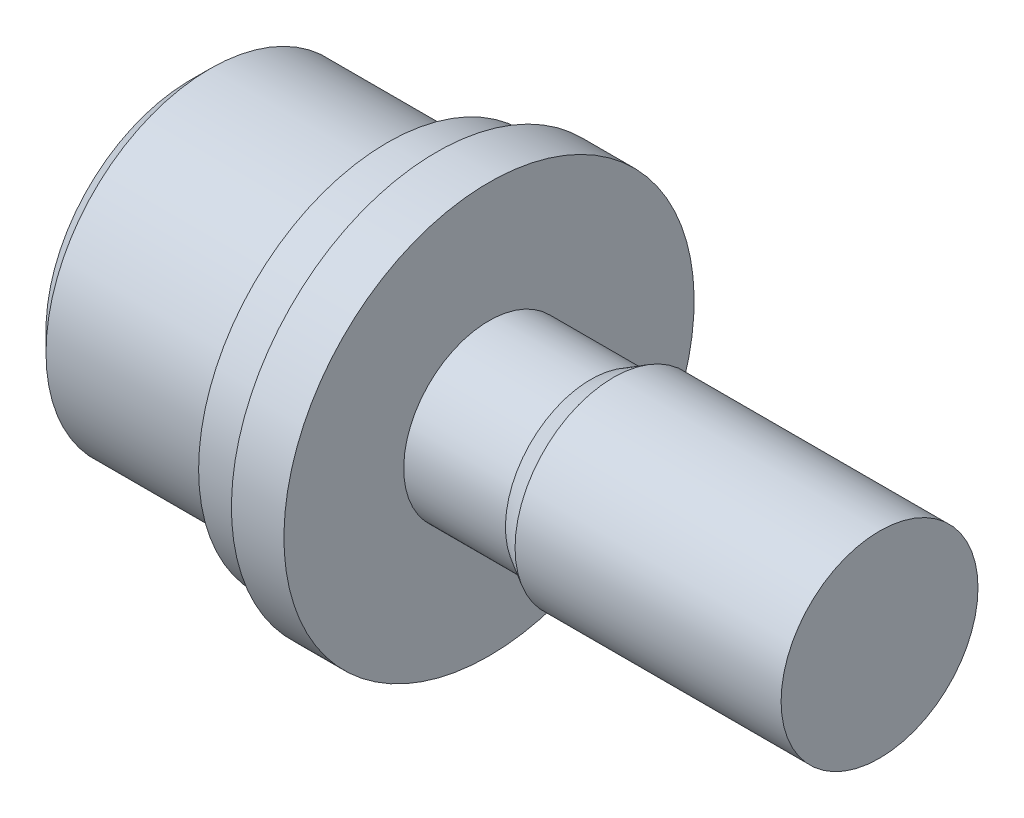
ISO-10303-21;
HEADER;
FILE_DESCRIPTION(('STEP AP214'),'2;1');
FILE_NAME('part.step','',(''),(''),'','','');
FILE_SCHEMA(('AUTOMOTIVE_DESIGN { 1 0 10303 214 1 1 1 1 }'));
ENDSEC;
DATA;
#1=APPLICATION_CONTEXT('core data for automotive mechanical design processes');
#2=APPLICATION_PROTOCOL_DEFINITION('international standard','automotive_design',2000,#1);
#3=PRODUCT_CONTEXT('',#1,'mechanical');
#4=PRODUCT('Part','Part','',(#3));
#5=PRODUCT_RELATED_PRODUCT_CATEGORY('part','',(#4));
#6=PRODUCT_DEFINITION_FORMATION('','',#4);
#7=PRODUCT_DEFINITION_CONTEXT('part definition',#1,'design');
#8=PRODUCT_DEFINITION('design','',#6,#7);
#9=PRODUCT_DEFINITION_SHAPE('','',#8);
#10=(LENGTH_UNIT() NAMED_UNIT(*) SI_UNIT(.MILLI.,.METRE.));
#11=(NAMED_UNIT(*) PLANE_ANGLE_UNIT() SI_UNIT($,.RADIAN.));
#12=(NAMED_UNIT(*) SI_UNIT($,.STERADIAN.) SOLID_ANGLE_UNIT());
#13=UNCERTAINTY_MEASURE_WITH_UNIT(LENGTH_MEASURE(1.E-05),#10,'distance_accuracy_value','');
#14=(GEOMETRIC_REPRESENTATION_CONTEXT(3) GLOBAL_UNCERTAINTY_ASSIGNED_CONTEXT((#13)) GLOBAL_UNIT_ASSIGNED_CONTEXT((#10,
#11,#12)) REPRESENTATION_CONTEXT('',''));
#15=CARTESIAN_POINT('',(0.,0.,0.));
#16=DIRECTION('',(0.,0.,1.));
#17=DIRECTION('',(1.,0.,0.));
#18=AXIS2_PLACEMENT_3D('',#15,#16,#17);
#19=CARTESIAN_POINT('',(-3.9,0.,0.));
#20=DIRECTION('',(-1.,0.,0.));
#21=DIRECTION('',(0.,0.,1.));
#22=AXIS2_PLACEMENT_3D('',#19,#20,#21);
#23=PLANE('',#22);
#24=DIRECTION('',(0.,-0.5,-0.866025403784438));
#25=VECTOR('',#24,1.);
#26=CARTESIAN_POINT('',(-3.9,2.1650635094611,-1.25));
#27=LINE('',#26,#25);
#28=CARTESIAN_POINT('',(-3.89999999999995,2.16506350946107,-1.24999999999999));
#29=VERTEX_POINT('',#28);
#30=CARTESIAN_POINT('',(-3.9,1.44337567297406,-2.5));
#31=VERTEX_POINT('',#30);
#32=EDGE_CURVE('E92',#29,#31,#27,.T.);
#33=ORIENTED_EDGE('',*,*,#32,.T.);
#34=DIRECTION('',(0.,1.,0.));
#35=VECTOR('',#34,1.);
#36=CARTESIAN_POINT('',(-3.9,0.,-2.5));
#37=LINE('',#36,#35);
#38=CARTESIAN_POINT('',(-3.89999999999995,0.,-2.49999999999997));
#39=VERTEX_POINT('',#38);
#40=EDGE_CURVE('E89',#31,#39,#37,.F.);
#41=ORIENTED_EDGE('',*,*,#40,.T.);
#42=CARTESIAN_POINT('',(-3.8999999999999,0.,0.));
#43=DIRECTION('',(-1.,0.,0.));
#44=DIRECTION('',(0.,0.,1.));
#45=AXIS2_PLACEMENT_3D('',#42,#43,#44);
#46=CIRCLE('',#45,2.49999999999995);
#47=EDGE_CURVE('E20',#39,#29,#46,.F.);
#48=ORIENTED_EDGE('',*,*,#47,.T.);
#49=EDGE_LOOP('',(#33,#41,#48));
#50=FACE_BOUND('',#49,.T.);
#51=ADVANCED_FACE('F17',(#50),#23,.T.);
#52=CARTESIAN_POINT('',(-3.9,0.,0.));
#53=DIRECTION('',(-1.,0.,0.));
#54=DIRECTION('',(0.,0.,1.));
#55=AXIS2_PLACEMENT_3D('',#52,#53,#54);
#56=PLANE('',#55);
#57=DIRECTION('',(0.,0.5,-0.866025403784439));
#58=VECTOR('',#57,1.);
#59=CARTESIAN_POINT('',(-3.9,2.1650635094611,1.25));
#60=LINE('',#59,#58);
#61=CARTESIAN_POINT('',(-3.89999999999995,2.16506350946107,1.24999999999999));
#62=VERTEX_POINT('',#61);
#63=CARTESIAN_POINT('',(-3.9,2.88675134594813,0.));
#64=VERTEX_POINT('',#63);
#65=EDGE_CURVE('E97',#62,#64,#60,.T.);
#66=ORIENTED_EDGE('',*,*,#65,.T.);
#67=DIRECTION('',(0.,-0.5,-0.866025403784439));
#68=VECTOR('',#67,1.);
#69=CARTESIAN_POINT('',(-3.9,2.88675134594813,0.));
#70=LINE('',#69,#68);
#71=EDGE_CURVE('E139',#64,#29,#70,.T.);
#72=ORIENTED_EDGE('',*,*,#71,.T.);
#73=CARTESIAN_POINT('',(-3.8999999999999,0.,0.));
#74=DIRECTION('',(-1.,0.,0.));
#75=DIRECTION('',(0.,0.,1.));
#76=AXIS2_PLACEMENT_3D('',#73,#74,#75);
#77=CIRCLE('',#76,2.49999999999995);
#78=EDGE_CURVE('E108',#29,#62,#77,.F.);
#79=ORIENTED_EDGE('',*,*,#78,.T.);
#80=EDGE_LOOP('',(#66,#72,#79));
#81=FACE_BOUND('',#80,.T.);
#82=ADVANCED_FACE('F188',(#81),#56,.T.);
#83=CARTESIAN_POINT('',(-3.9,0.,0.));
#84=DIRECTION('',(-1.,0.,0.));
#85=DIRECTION('',(0.,0.,1.));
#86=AXIS2_PLACEMENT_3D('',#83,#84,#85);
#87=PLANE('',#86);
#88=DIRECTION('',(0.,1.,0.));
#89=VECTOR('',#88,1.);
#90=CARTESIAN_POINT('',(-3.9,0.,2.5));
#91=LINE('',#90,#89);
#92=CARTESIAN_POINT('',(-3.89999999999996,0.,2.50000000000002));
#93=VERTEX_POINT('',#92);
#94=CARTESIAN_POINT('',(-3.9,1.44337567297406,2.5));
#95=VERTEX_POINT('',#94);
#96=EDGE_CURVE('E137',#93,#95,#91,.T.);
#97=ORIENTED_EDGE('',*,*,#96,.T.);
#98=DIRECTION('',(0.,0.5,-0.866025403784438));
#99=VECTOR('',#98,1.);
#100=CARTESIAN_POINT('',(-3.9,1.44337567297406,2.5));
#101=LINE('',#100,#99);
#102=EDGE_CURVE('E135',#95,#62,#101,.T.);
#103=ORIENTED_EDGE('',*,*,#102,.T.);
#104=CARTESIAN_POINT('',(-3.8999999999999,0.,0.));
#105=DIRECTION('',(-1.,0.,0.));
#106=DIRECTION('',(0.,0.,1.));
#107=AXIS2_PLACEMENT_3D('',#104,#105,#106);
#108=CIRCLE('',#107,2.49999999999995);
#109=EDGE_CURVE('E185',#62,#93,#108,.F.);
#110=ORIENTED_EDGE('',*,*,#109,.T.);
#111=EDGE_LOOP('',(#97,#103,#110));
#112=FACE_BOUND('',#111,.T.);
#113=ADVANCED_FACE('F429',(#112),#87,.T.);
#114=CARTESIAN_POINT('',(-3.9,0.,0.));
#115=DIRECTION('',(-1.,0.,0.));
#116=DIRECTION('',(0.,0.,1.));
#117=AXIS2_PLACEMENT_3D('',#114,#115,#116);
#118=PLANE('',#117);
#119=DIRECTION('',(0.,0.500000000000001,0.866025403784438));
#120=VECTOR('',#119,1.);
#121=CARTESIAN_POINT('',(-3.9,-2.1650635094611,1.25));
#122=LINE('',#121,#120);
#123=CARTESIAN_POINT('',(-3.89999999999995,-2.16506350946108,1.24999999999999));
#124=VERTEX_POINT('',#123);
#125=CARTESIAN_POINT('',(-3.9,-1.44337567297406,2.5));
#126=VERTEX_POINT('',#125);
#127=EDGE_CURVE('E133',#124,#126,#122,.T.);
#128=ORIENTED_EDGE('',*,*,#127,.T.);
#129=DIRECTION('',(0.,1.,0.));
#130=VECTOR('',#129,1.);
#131=CARTESIAN_POINT('',(-3.9,0.,2.5));
#132=LINE('',#131,#130);
#133=EDGE_CURVE('E131',#126,#93,#132,.T.);
#134=ORIENTED_EDGE('',*,*,#133,.T.);
#135=CARTESIAN_POINT('',(-3.8999999999999,0.,0.));
#136=DIRECTION('',(-1.,0.,0.));
#137=DIRECTION('',(0.,0.,1.));
#138=AXIS2_PLACEMENT_3D('',#135,#136,#137);
#139=CIRCLE('',#138,2.49999999999995);
#140=EDGE_CURVE('E182',#93,#124,#139,.F.);
#141=ORIENTED_EDGE('',*,*,#140,.T.);
#142=EDGE_LOOP('',(#128,#134,#141));
#143=FACE_BOUND('',#142,.T.);
#144=ADVANCED_FACE('F419',(#143),#118,.T.);
#145=CARTESIAN_POINT('',(-3.9,0.,0.));
#146=DIRECTION('',(-1.,0.,0.));
#147=DIRECTION('',(0.,0.,1.));
#148=AXIS2_PLACEMENT_3D('',#145,#146,#147);
#149=PLANE('',#148);
#150=DIRECTION('',(0.,-0.5,0.866025403784439));
#151=VECTOR('',#150,1.);
#152=CARTESIAN_POINT('',(-3.9,-2.1650635094611,-1.25));
#153=LINE('',#152,#151);
#154=CARTESIAN_POINT('',(-3.89999999999995,-2.16506350946107,-1.24999999999999));
#155=VERTEX_POINT('',#154);
#156=CARTESIAN_POINT('',(-3.9,-2.88675134594813,0.));
#157=VERTEX_POINT('',#156);
#158=EDGE_CURVE('E129',#155,#157,#153,.T.);
#159=ORIENTED_EDGE('',*,*,#158,.T.);
#160=DIRECTION('',(0.,0.499999999999999,0.866025403784439));
#161=VECTOR('',#160,1.);
#162=CARTESIAN_POINT('',(-3.9,-2.88675134594813,0.));
#163=LINE('',#162,#161);
#164=EDGE_CURVE('E109',#157,#124,#163,.T.);
#165=ORIENTED_EDGE('',*,*,#164,.T.);
#166=CARTESIAN_POINT('',(-3.8999999999999,0.,0.));
#167=DIRECTION('',(-1.,0.,0.));
#168=DIRECTION('',(0.,0.,1.));
#169=AXIS2_PLACEMENT_3D('',#166,#167,#168);
#170=CIRCLE('',#169,2.49999999999995);
#171=EDGE_CURVE('E117',#124,#155,#170,.F.);
#172=ORIENTED_EDGE('',*,*,#171,.T.);
#173=EDGE_LOOP('',(#159,#165,#172));
#174=FACE_BOUND('',#173,.T.);
#175=ADVANCED_FACE('F409',(#174),#149,.T.);
#176=CARTESIAN_POINT('',(-3.8999999999999,0.,0.));
#177=DIRECTION('',(-1.,0.,0.));
#178=DIRECTION('',(0.,0.,1.));
#179=AXIS2_PLACEMENT_3D('',#176,#177,#178);
#180=CONICAL_SURFACE('',#179,2.49999999999995,1.0471975511966);
#181=CARTESIAN_POINT('',(-2.45662432702587,0.,0.));
#182=VERTEX_POINT('',#181);
#183=VERTEX_LOOP('',#182);
#184=FACE_BOUND('',#183,.T.);
#185=ORIENTED_EDGE('',*,*,#47,.F.);
#186=CARTESIAN_POINT('',(-3.8999999999999,0.,0.));
#187=DIRECTION('',(-1.,0.,0.));
#188=DIRECTION('',(0.,0.,1.));
#189=AXIS2_PLACEMENT_3D('',#186,#187,#188);
#190=CIRCLE('',#189,2.49999999999995);
#191=EDGE_CURVE('E105',#155,#39,#190,.F.);
#192=ORIENTED_EDGE('',*,*,#191,.F.);
#193=ORIENTED_EDGE('',*,*,#171,.F.);
#194=ORIENTED_EDGE('',*,*,#140,.F.);
#195=ORIENTED_EDGE('',*,*,#109,.F.);
#196=ORIENTED_EDGE('',*,*,#78,.F.);
#197=EDGE_LOOP('',(#185,#192,#193,#194,#195,#196));
#198=FACE_BOUND('',#197,.T.);
#199=ADVANCED_FACE('F103',(#184,#198),#180,.F.);
#200=CARTESIAN_POINT('',(-3.9,0.,0.));
#201=DIRECTION('',(-1.,0.,0.));
#202=DIRECTION('',(0.,0.,1.));
#203=AXIS2_PLACEMENT_3D('',#200,#201,#202);
#204=PLANE('',#203);
#205=DIRECTION('',(0.,1.,0.));
#206=VECTOR('',#205,1.);
#207=CARTESIAN_POINT('',(-3.9,1.44337567297406,-2.5));
#208=LINE('',#207,#206);
#209=CARTESIAN_POINT('',(-3.9,-1.44337567297406,-2.5));
#210=VERTEX_POINT('',#209);
#211=EDGE_CURVE('E114',#39,#210,#208,.F.);
#212=ORIENTED_EDGE('',*,*,#211,.T.);
#213=DIRECTION('',(0.,-0.5,0.866025403784439));
#214=VECTOR('',#213,1.);
#215=CARTESIAN_POINT('',(-3.9,-1.44337567297406,-2.5));
#216=LINE('',#215,#214);
#217=EDGE_CURVE('E116',#210,#155,#216,.T.);
#218=ORIENTED_EDGE('',*,*,#217,.T.);
#219=ORIENTED_EDGE('',*,*,#191,.T.);
#220=EDGE_LOOP('',(#212,#218,#219));
#221=FACE_BOUND('',#220,.T.);
#222=ADVANCED_FACE('F113',(#221),#204,.T.);
#223=CARTESIAN_POINT('',(-3.9,1.44337567297406,-2.5));
#224=DIRECTION('',(0.,0.,-1.));
#225=DIRECTION('',(-1.,0.,0.));
#226=AXIS2_PLACEMENT_3D('',#223,#224,#225);
#227=PLANE('',#226);
#228=DIRECTION('',(1.,0.,0.));
#229=VECTOR('',#228,1.);
#230=CARTESIAN_POINT('',(-3.9,-1.44337567297406,-2.5));
#231=LINE('',#230,#229);
#232=CARTESIAN_POINT('',(-9.1,-1.44337567297406,-2.5));
#233=VERTEX_POINT('',#232);
#234=EDGE_CURVE('E121',#233,#210,#231,.T.);
#235=ORIENTED_EDGE('',*,*,#234,.T.);
#236=ORIENTED_EDGE('',*,*,#211,.F.);
#237=ORIENTED_EDGE('',*,*,#40,.F.);
#238=DIRECTION('',(1.,0.,0.));
#239=VECTOR('',#238,1.);
#240=CARTESIAN_POINT('',(-3.9,1.44337567297406,-2.5));
#241=LINE('',#240,#239);
#242=CARTESIAN_POINT('',(-9.1,1.44337567297406,-2.5));
#243=VERTEX_POINT('',#242);
#244=EDGE_CURVE('E153',#31,#243,#241,.F.);
#245=ORIENTED_EDGE('',*,*,#244,.T.);
#246=DIRECTION('',(0.,1.,0.));
#247=VECTOR('',#246,1.);
#248=CARTESIAN_POINT('',(-9.1,5.,-2.5));
#249=LINE('',#248,#247);
#250=EDGE_CURVE('E154',#243,#233,#249,.F.);
#251=ORIENTED_EDGE('',*,*,#250,.T.);
#252=EDGE_LOOP('',(#235,#236,#237,#245,#251));
#253=FACE_BOUND('',#252,.T.);
#254=ADVANCED_FACE('F119',(#253),#227,.F.);
#255=CARTESIAN_POINT('',(-3.9,-1.44337567297406,-2.5));
#256=DIRECTION('',(0.,-0.866025403784439,-0.5));
#257=DIRECTION('',(0.,0.5,-0.866025403784439));
#258=AXIS2_PLACEMENT_3D('',#255,#256,#257);
#259=PLANE('',#258);
#260=DIRECTION('',(1.,0.,0.));
#261=VECTOR('',#260,1.);
#262=CARTESIAN_POINT('',(-3.9,-2.88675134594813,0.));
#263=LINE('',#262,#261);
#264=CARTESIAN_POINT('',(-9.1,-2.88675134594813,0.));
#265=VERTEX_POINT('',#264);
#266=EDGE_CURVE('E123',#265,#157,#263,.T.);
#267=ORIENTED_EDGE('',*,*,#266,.T.);
#268=ORIENTED_EDGE('',*,*,#158,.F.);
#269=ORIENTED_EDGE('',*,*,#217,.F.);
#270=ORIENTED_EDGE('',*,*,#234,.F.);
#271=DIRECTION('',(0.,-0.5,0.866025403784439));
#272=VECTOR('',#271,1.);
#273=CARTESIAN_POINT('',(-9.1,-1.44337567297406,-2.5));
#274=LINE('',#273,#272);
#275=EDGE_CURVE('E193',#233,#265,#274,.T.);
#276=ORIENTED_EDGE('',*,*,#275,.T.);
#277=EDGE_LOOP('',(#267,#268,#269,#270,#276));
#278=FACE_BOUND('',#277,.T.);
#279=ADVANCED_FACE('F374',(#278),#259,.F.);
#280=CARTESIAN_POINT('',(-3.9,-2.88675134594813,0.));
#281=DIRECTION('',(0.,-0.866025403784439,0.5));
#282=DIRECTION('',(0.,-0.5,-0.866025403784439));
#283=AXIS2_PLACEMENT_3D('',#280,#281,#282);
#284=PLANE('',#283);
#285=DIRECTION('',(1.,0.,0.));
#286=VECTOR('',#285,1.);
#287=CARTESIAN_POINT('',(-3.9,-1.44337567297406,2.5));
#288=LINE('',#287,#286);
#289=CARTESIAN_POINT('',(-9.1,-1.44337567297406,2.5));
#290=VERTEX_POINT('',#289);
#291=EDGE_CURVE('E146',#290,#126,#288,.T.);
#292=ORIENTED_EDGE('',*,*,#291,.T.);
#293=ORIENTED_EDGE('',*,*,#127,.F.);
#294=ORIENTED_EDGE('',*,*,#164,.F.);
#295=ORIENTED_EDGE('',*,*,#266,.F.);
#296=DIRECTION('',(0.,0.5,0.866025403784439));
#297=VECTOR('',#296,1.);
#298=CARTESIAN_POINT('',(-9.1,-2.88675134594813,0.));
#299=LINE('',#298,#297);
#300=EDGE_CURVE('E195',#265,#290,#299,.T.);
#301=ORIENTED_EDGE('',*,*,#300,.T.);
#302=EDGE_LOOP('',(#292,#293,#294,#295,#301));
#303=FACE_BOUND('',#302,.T.);
#304=ADVANCED_FACE('F364',(#303),#284,.F.);
#305=CARTESIAN_POINT('',(-3.9,-1.44337567297406,2.5));
#306=DIRECTION('',(0.,0.,1.));
#307=DIRECTION('',(1.,0.,0.));
#308=AXIS2_PLACEMENT_3D('',#305,#306,#307);
#309=PLANE('',#308);
#310=DIRECTION('',(1.,0.,0.));
#311=VECTOR('',#310,1.);
#312=CARTESIAN_POINT('',(-3.9,1.44337567297406,2.5));
#313=LINE('',#312,#311);
#314=CARTESIAN_POINT('',(-9.1,1.44337567297406,2.5));
#315=VERTEX_POINT('',#314);
#316=EDGE_CURVE('E149',#315,#95,#313,.T.);
#317=ORIENTED_EDGE('',*,*,#316,.T.);
#318=ORIENTED_EDGE('',*,*,#96,.F.);
#319=ORIENTED_EDGE('',*,*,#133,.F.);
#320=ORIENTED_EDGE('',*,*,#291,.F.);
#321=DIRECTION('',(0.,1.,0.));
#322=VECTOR('',#321,1.);
#323=CARTESIAN_POINT('',(-9.1,5.,2.5));
#324=LINE('',#323,#322);
#325=EDGE_CURVE('E200',#290,#315,#324,.T.);
#326=ORIENTED_EDGE('',*,*,#325,.T.);
#327=EDGE_LOOP('',(#317,#318,#319,#320,#326));
#328=FACE_BOUND('',#327,.T.);
#329=ADVANCED_FACE('F354',(#328),#309,.F.);
#330=CARTESIAN_POINT('',(-3.9,1.44337567297406,2.5));
#331=DIRECTION('',(0.,0.866025403784439,0.5));
#332=DIRECTION('',(0.,-0.5,0.866025403784439));
#333=AXIS2_PLACEMENT_3D('',#330,#331,#332);
#334=PLANE('',#333);
#335=DIRECTION('',(1.,0.,0.));
#336=VECTOR('',#335,1.);
#337=CARTESIAN_POINT('',(-3.9,2.88675134594813,0.));
#338=LINE('',#337,#336);
#339=CARTESIAN_POINT('',(-9.1,2.88675134594813,0.));
#340=VERTEX_POINT('',#339);
#341=EDGE_CURVE('E35',#340,#64,#338,.T.);
#342=ORIENTED_EDGE('',*,*,#341,.T.);
#343=ORIENTED_EDGE('',*,*,#65,.F.);
#344=ORIENTED_EDGE('',*,*,#102,.F.);
#345=ORIENTED_EDGE('',*,*,#316,.F.);
#346=DIRECTION('',(0.,0.5,-0.866025403784439));
#347=VECTOR('',#346,1.);
#348=CARTESIAN_POINT('',(-9.1,1.44337567297406,2.5));
#349=LINE('',#348,#347);
#350=EDGE_CURVE('E203',#315,#340,#349,.T.);
#351=ORIENTED_EDGE('',*,*,#350,.T.);
#352=EDGE_LOOP('',(#342,#343,#344,#345,#351));
#353=FACE_BOUND('',#352,.T.);
#354=ADVANCED_FACE('F345',(#353),#334,.F.);
#355=CARTESIAN_POINT('',(-3.9,2.88675134594813,0.));
#356=DIRECTION('',(0.,0.866025403784439,-0.5));
#357=DIRECTION('',(0.,0.5,0.866025403784439));
#358=AXIS2_PLACEMENT_3D('',#355,#356,#357);
#359=PLANE('',#358);
#360=ORIENTED_EDGE('',*,*,#244,.F.);
#361=ORIENTED_EDGE('',*,*,#32,.F.);
#362=ORIENTED_EDGE('',*,*,#71,.F.);
#363=ORIENTED_EDGE('',*,*,#341,.F.);
#364=DIRECTION('',(0.,-0.5,-0.866025403784439));
#365=VECTOR('',#364,1.);
#366=CARTESIAN_POINT('',(-9.1,2.88675134594813,0.));
#367=LINE('',#366,#365);
#368=EDGE_CURVE('E178',#340,#243,#367,.T.);
#369=ORIENTED_EDGE('',*,*,#368,.T.);
#370=EDGE_LOOP('',(#360,#361,#362,#363,#369));
#371=FACE_BOUND('',#370,.T.);
#372=ADVANCED_FACE('F190',(#371),#359,.F.);
#373=CARTESIAN_POINT('',(-9.1,5.,0.));
#374=DIRECTION('',(1.,0.,0.));
#375=DIRECTION('',(0.,1.,0.));
#376=AXIS2_PLACEMENT_3D('',#373,#374,#375);
#377=PLANE('',#376);
#378=ORIENTED_EDGE('',*,*,#350,.F.);
#379=ORIENTED_EDGE('',*,*,#325,.F.);
#380=ORIENTED_EDGE('',*,*,#300,.F.);
#381=ORIENTED_EDGE('',*,*,#275,.F.);
#382=ORIENTED_EDGE('',*,*,#250,.F.);
#383=ORIENTED_EDGE('',*,*,#368,.F.);
#384=EDGE_LOOP('',(#378,#379,#380,#381,#382,#383));
#385=FACE_BOUND('',#384,.T.);
#386=CARTESIAN_POINT('',(-9.09999999993261,0.,0.));
#387=DIRECTION('',(1.,0.,0.));
#388=DIRECTION('',(0.,0.,-1.));
#389=AXIS2_PLACEMENT_3D('',#386,#387,#388);
#390=CIRCLE('',#389,4.40000000003238);
#391=CARTESIAN_POINT('',(-9.09999999993261,0.,-4.40000000003238));
#392=VERTEX_POINT('',#391);
#393=EDGE_CURVE('E176',#392,#392,#390,.T.);
#394=ORIENTED_EDGE('',*,*,#393,.F.);
#395=EDGE_LOOP('',(#394));
#396=FACE_BOUND('',#395,.T.);
#397=ADVANCED_FACE('F327',(#385,#396),#377,.F.);
#398=CARTESIAN_POINT('',(-8.50000000002638,0.,0.));
#399=DIRECTION('',(1.,0.,0.));
#400=DIRECTION('',(0.,0.,-1.));
#401=AXIS2_PLACEMENT_3D('',#398,#399,#400);
#402=CONICAL_SURFACE('',#401,4.99999999993861,0.785398163397448);
#403=CARTESIAN_POINT('',(-8.49999999999999,0.,0.));
#404=DIRECTION('',(-1.,0.,0.));
#405=DIRECTION('',(0.,-1.,0.));
#406=AXIS2_PLACEMENT_3D('',#403,#404,#405);
#407=CIRCLE('',#406,5.);
#408=CARTESIAN_POINT('',(-8.49999999999999,-5.,0.));
#409=VERTEX_POINT('',#408);
#410=EDGE_CURVE('E175',#409,#409,#407,.F.);
#411=ORIENTED_EDGE('',*,*,#410,.F.);
#412=EDGE_LOOP('',(#411));
#413=FACE_BOUND('',#412,.T.);
#414=ORIENTED_EDGE('',*,*,#393,.T.);
#415=EDGE_LOOP('',(#414));
#416=FACE_BOUND('',#415,.T.);
#417=ADVANCED_FACE('F317',(#413,#416),#402,.T.);
#418=CARTESIAN_POINT('',(-9.1,0.,0.));
#419=DIRECTION('',(-1.,0.,0.));
#420=DIRECTION('',(0.,-1.,0.));
#421=AXIS2_PLACEMENT_3D('',#418,#419,#420);
#422=CYLINDRICAL_SURFACE('',#421,5.);
#423=ORIENTED_EDGE('',*,*,#410,.T.);
#424=EDGE_LOOP('',(#423));
#425=FACE_BOUND('',#424,.T.);
#426=CARTESIAN_POINT('',(-3.1,0.,0.));
#427=DIRECTION('',(-1.,0.,0.));
#428=DIRECTION('',(0.,-1.,0.));
#429=AXIS2_PLACEMENT_3D('',#426,#427,#428);
#430=CIRCLE('',#429,5.);
#431=CARTESIAN_POINT('',(-3.1,-5.,0.));
#432=VERTEX_POINT('',#431);
#433=EDGE_CURVE('E172',#432,#432,#430,.T.);
#434=ORIENTED_EDGE('',*,*,#433,.T.);
#435=EDGE_LOOP('',(#434));
#436=FACE_BOUND('',#435,.T.);
#437=ADVANCED_FACE('F307',(#425,#436),#422,.T.);
#438=CARTESIAN_POINT('',(-3.1,5.75,0.));
#439=DIRECTION('',(1.,0.,0.));
#440=DIRECTION('',(0.,1.,0.));
#441=AXIS2_PLACEMENT_3D('',#438,#439,#440);
#442=PLANE('',#441);
#443=CARTESIAN_POINT('',(-3.1,0.,0.));
#444=DIRECTION('',(-1.,0.,0.));
#445=DIRECTION('',(0.,-1.,0.));
#446=AXIS2_PLACEMENT_3D('',#443,#444,#445);
#447=CIRCLE('',#446,5.75);
#448=CARTESIAN_POINT('',(-3.1,-5.75,0.));
#449=VERTEX_POINT('',#448);
#450=EDGE_CURVE('E169',#449,#449,#447,.F.);
#451=ORIENTED_EDGE('',*,*,#450,.F.);
#452=EDGE_LOOP('',(#451));
#453=FACE_BOUND('',#452,.T.);
#454=ORIENTED_EDGE('',*,*,#433,.F.);
#455=EDGE_LOOP('',(#454));
#456=FACE_BOUND('',#455,.T.);
#457=ADVANCED_FACE('F297',(#453,#456),#442,.F.);
#458=CARTESIAN_POINT('',(11.9,3.,0.));
#459=DIRECTION('',(-1.,0.,0.));
#460=DIRECTION('',(0.,-1.,0.));
#461=AXIS2_PLACEMENT_3D('',#458,#459,#460);
#462=PLANE('',#461);
#463=CARTESIAN_POINT('',(11.9,0.,0.));
#464=DIRECTION('',(-1.,0.,0.));
#465=DIRECTION('',(0.,-1.,0.));
#466=AXIS2_PLACEMENT_3D('',#463,#464,#465);
#467=CIRCLE('',#466,3.);
#468=CARTESIAN_POINT('',(11.9,-3.,0.));
#469=VERTEX_POINT('',#468);
#470=EDGE_CURVE('E166',#469,#469,#467,.T.);
#471=ORIENTED_EDGE('',*,*,#470,.F.);
#472=EDGE_LOOP('',(#471));
#473=FACE_BOUND('',#472,.T.);
#474=ADVANCED_FACE('F287',(#473),#462,.F.);
#475=CARTESIAN_POINT('',(-9.1,0.,0.));
#476=DIRECTION('',(-1.,0.,0.));
#477=DIRECTION('',(0.,-1.,0.));
#478=AXIS2_PLACEMENT_3D('',#475,#476,#477);
#479=CYLINDRICAL_SURFACE('',#478,5.75);
#480=ORIENTED_EDGE('',*,*,#450,.T.);
#481=EDGE_LOOP('',(#480));
#482=FACE_BOUND('',#481,.T.);
#483=CARTESIAN_POINT('',(-1.6,0.,0.));
#484=DIRECTION('',(-1.,0.,0.));
#485=DIRECTION('',(0.,-1.,0.));
#486=AXIS2_PLACEMENT_3D('',#483,#484,#485);
#487=CIRCLE('',#486,5.75);
#488=CARTESIAN_POINT('',(-1.6,-5.75,0.));
#489=VERTEX_POINT('',#488);
#490=EDGE_CURVE('E163',#489,#489,#487,.T.);
#491=ORIENTED_EDGE('',*,*,#490,.T.);
#492=EDGE_LOOP('',(#491));
#493=FACE_BOUND('',#492,.T.);
#494=ADVANCED_FACE('F276',(#482,#493),#479,.T.);
#495=CARTESIAN_POINT('',(-9.1,0.,0.));
#496=DIRECTION('',(-1.,0.,0.));
#497=DIRECTION('',(0.,-1.,0.));
#498=AXIS2_PLACEMENT_3D('',#495,#496,#497);
#499=CYLINDRICAL_SURFACE('',#498,3.);
#500=CARTESIAN_POINT('',(3.79282032304218,0.,0.));
#501=DIRECTION('',(1.,0.,0.));
#502=DIRECTION('',(0.,1.,0.));
#503=AXIS2_PLACEMENT_3D('',#500,#501,#502);
#504=CIRCLE('',#503,2.9999999999859);
#505=CARTESIAN_POINT('',(3.79282032304218,2.9999999999859,0.));
#506=VERTEX_POINT('',#505);
#507=EDGE_CURVE('E162',#506,#506,#504,.F.);
#508=ORIENTED_EDGE('',*,*,#507,.F.);
#509=EDGE_LOOP('',(#508));
#510=FACE_BOUND('',#509,.T.);
#511=ORIENTED_EDGE('',*,*,#470,.T.);
#512=EDGE_LOOP('',(#511));
#513=FACE_BOUND('',#512,.T.);
#514=ADVANCED_FACE('F229',(#510,#513),#499,.T.);
#515=CARTESIAN_POINT('',(-1.6,5.75,0.));
#516=DIRECTION('',(1.,0.,0.));
#517=DIRECTION('',(0.,1.,0.));
#518=AXIS2_PLACEMENT_3D('',#515,#516,#517);
#519=PLANE('',#518);
#520=CARTESIAN_POINT('',(-1.6,0.,0.));
#521=DIRECTION('',(-1.,0.,0.));
#522=DIRECTION('',(0.,-1.,0.));
#523=AXIS2_PLACEMENT_3D('',#520,#521,#522);
#524=CIRCLE('',#523,6.25);
#525=CARTESIAN_POINT('',(-1.6,-6.25,0.));
#526=VERTEX_POINT('',#525);
#527=EDGE_CURVE('E159',#526,#526,#524,.F.);
#528=ORIENTED_EDGE('',*,*,#527,.F.);
#529=EDGE_LOOP('',(#528));
#530=FACE_BOUND('',#529,.T.);
#531=ORIENTED_EDGE('',*,*,#490,.F.);
#532=EDGE_LOOP('',(#531));
#533=FACE_BOUND('',#532,.T.);
#534=ADVANCED_FACE('F219',(#530,#533),#519,.F.);
#535=CARTESIAN_POINT('',(3.7928203228148,0.,0.));
#536=DIRECTION('',(1.,0.,0.));
#537=DIRECTION('',(0.,0.,-1.));
#538=AXIS2_PLACEMENT_3D('',#535,#536,#537);
#539=CONICAL_SURFACE('',#538,2.99999999987222,0.523598775614559);
#540=ORIENTED_EDGE('',*,*,#507,.T.);
#541=EDGE_LOOP('',(#540));
#542=FACE_BOUND('',#541,.T.);
#543=CARTESIAN_POINT('',(3.1,0.,0.));
#544=DIRECTION('',(-1.,0.,0.));
#545=DIRECTION('',(0.,-1.,0.));
#546=AXIS2_PLACEMENT_3D('',#543,#544,#545);
#547=CIRCLE('',#546,2.6);
#548=CARTESIAN_POINT('',(3.1,-2.6,0.));
#549=VERTEX_POINT('',#548);
#550=EDGE_CURVE('E158',#549,#549,#547,.T.);
#551=ORIENTED_EDGE('',*,*,#550,.F.);
#552=EDGE_LOOP('',(#551));
#553=FACE_BOUND('',#552,.T.);
#554=ADVANCED_FACE('F216',(#542,#553),#539,.T.);
#555=CARTESIAN_POINT('',(-9.1,0.,0.));
#556=DIRECTION('',(-1.,0.,0.));
#557=DIRECTION('',(0.,-1.,0.));
#558=AXIS2_PLACEMENT_3D('',#555,#556,#557);
#559=CYLINDRICAL_SURFACE('',#558,6.25);
#560=ORIENTED_EDGE('',*,*,#527,.T.);
#561=EDGE_LOOP('',(#560));
#562=FACE_BOUND('',#561,.T.);
#563=CARTESIAN_POINT('',(0.,0.,0.));
#564=DIRECTION('',(-1.,0.,0.));
#565=DIRECTION('',(0.,-1.,0.));
#566=AXIS2_PLACEMENT_3D('',#563,#564,#565);
#567=CIRCLE('',#566,6.25);
#568=CARTESIAN_POINT('',(0.,-6.25,0.));
#569=VERTEX_POINT('',#568);
#570=EDGE_CURVE('E26',#569,#569,#567,.T.);
#571=ORIENTED_EDGE('',*,*,#570,.T.);
#572=EDGE_LOOP('',(#571));
#573=FACE_BOUND('',#572,.T.);
#574=ADVANCED_FACE('F218',(#562,#573),#559,.T.);
#575=CARTESIAN_POINT('',(-9.1,0.,0.));
#576=DIRECTION('',(-1.,0.,0.));
#577=DIRECTION('',(0.,-1.,0.));
#578=AXIS2_PLACEMENT_3D('',#575,#576,#577);
#579=CYLINDRICAL_SURFACE('',#578,2.6);
#580=CARTESIAN_POINT('',(0.,0.,0.));
#581=DIRECTION('',(-1.,0.,0.));
#582=DIRECTION('',(0.,-1.,0.));
#583=AXIS2_PLACEMENT_3D('',#580,#581,#582);
#584=CIRCLE('',#583,2.6);
#585=CARTESIAN_POINT('',(0.,-2.6,0.));
#586=VERTEX_POINT('',#585);
#587=EDGE_CURVE('E10',#586,#586,#584,.F.);
#588=ORIENTED_EDGE('',*,*,#587,.T.);
#589=EDGE_LOOP('',(#588));
#590=FACE_BOUND('',#589,.T.);
#591=ORIENTED_EDGE('',*,*,#550,.T.);
#592=EDGE_LOOP('',(#591));
#593=FACE_BOUND('',#592,.T.);
#594=ADVANCED_FACE('F214',(#590,#593),#579,.T.);
#595=CARTESIAN_POINT('',(0.,2.6,0.));
#596=DIRECTION('',(-1.,0.,0.));
#597=DIRECTION('',(0.,-1.,0.));
#598=AXIS2_PLACEMENT_3D('',#595,#596,#597);
#599=PLANE('',#598);
#600=ORIENTED_EDGE('',*,*,#587,.F.);
#601=EDGE_LOOP('',(#600));
#602=FACE_BOUND('',#601,.T.);
#603=ORIENTED_EDGE('',*,*,#570,.F.);
#604=EDGE_LOOP('',(#603));
#605=FACE_BOUND('',#604,.T.);
#606=ADVANCED_FACE('F232',(#602,#605),#599,.F.);
#607=CLOSED_SHELL('',(#51,#82,#113,#144,#175,#199,#222,#254,#279,#304,#329,#354,#372,#397,#417,
#437,#457,#474,#494,#514,#534,#554,#574,#594,#606));
#608=MANIFOLD_SOLID_BREP('B1',#607);
#609=ADVANCED_BREP_SHAPE_REPRESENTATION('',(#18,#608),#14);
#610=SHAPE_DEFINITION_REPRESENTATION(#9,#609);
ENDSEC;
END-ISO-10303-21;
